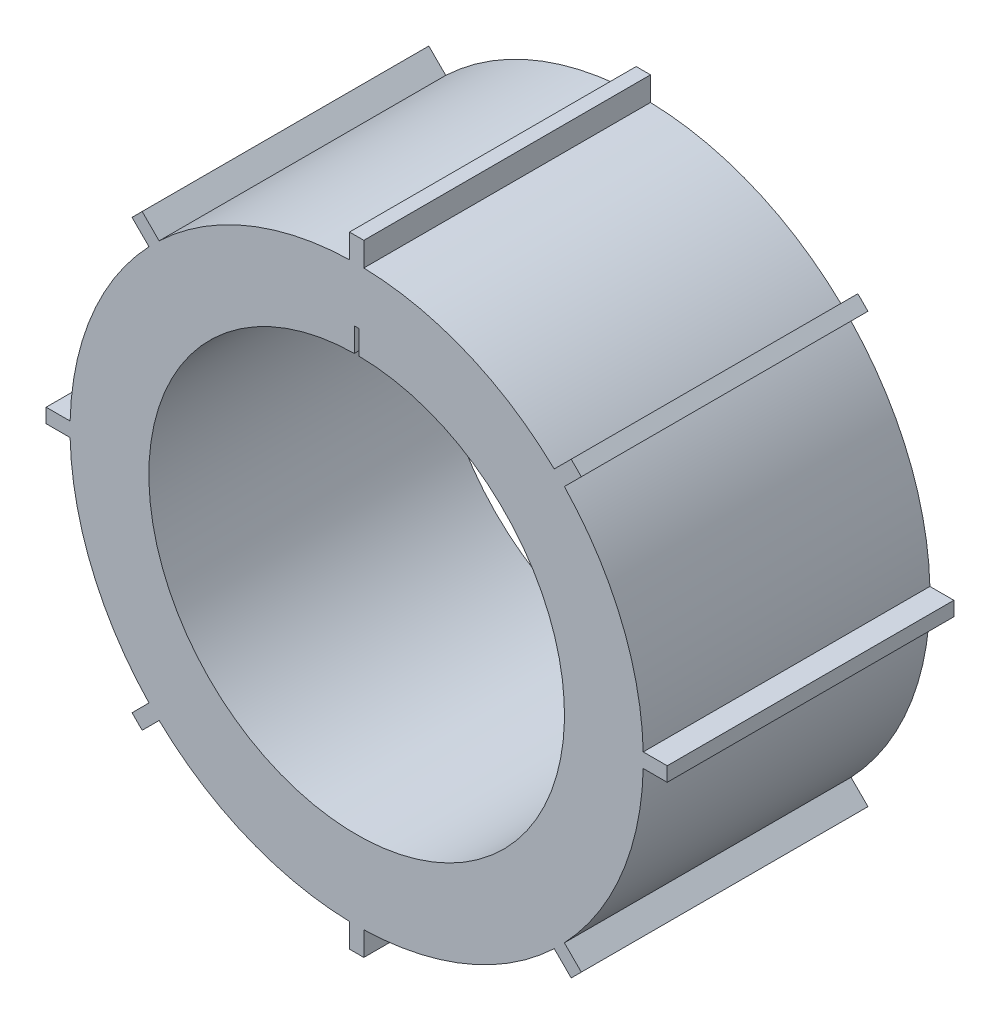
ISO-10303-21;
HEADER;
FILE_DESCRIPTION(('STEP AP214'),'2;1');
FILE_NAME('part.step','',(''),(''),'','','');
FILE_SCHEMA(('AUTOMOTIVE_DESIGN { 1 0 10303 214 1 1 1 1 }'));
ENDSEC;
DATA;
#1=APPLICATION_CONTEXT('core data for automotive mechanical design processes');
#2=APPLICATION_PROTOCOL_DEFINITION('international standard','automotive_design',2000,#1);
#3=PRODUCT_CONTEXT('',#1,'mechanical');
#4=PRODUCT('Part','Part','',(#3));
#5=PRODUCT_RELATED_PRODUCT_CATEGORY('part','',(#4));
#6=PRODUCT_DEFINITION_FORMATION('','',#4);
#7=PRODUCT_DEFINITION_CONTEXT('part definition',#1,'design');
#8=PRODUCT_DEFINITION('design','',#6,#7);
#9=PRODUCT_DEFINITION_SHAPE('','',#8);
#10=(LENGTH_UNIT() NAMED_UNIT(*) SI_UNIT(.MILLI.,.METRE.));
#11=(NAMED_UNIT(*) PLANE_ANGLE_UNIT() SI_UNIT($,.RADIAN.));
#12=(NAMED_UNIT(*) SI_UNIT($,.STERADIAN.) SOLID_ANGLE_UNIT());
#13=UNCERTAINTY_MEASURE_WITH_UNIT(LENGTH_MEASURE(1.E-05),#10,'distance_accuracy_value','');
#14=(GEOMETRIC_REPRESENTATION_CONTEXT(3) GLOBAL_UNCERTAINTY_ASSIGNED_CONTEXT((#13)) GLOBAL_UNIT_ASSIGNED_CONTEXT((#10,
#11,#12)) REPRESENTATION_CONTEXT('',''));
#15=CARTESIAN_POINT('',(0.,0.,0.));
#16=DIRECTION('',(0.,0.,1.));
#17=DIRECTION('',(1.,0.,0.));
#18=AXIS2_PLACEMENT_3D('',#15,#16,#17);
#19=CARTESIAN_POINT('',(0.,0.,60.));
#20=DIRECTION('',(0.,0.,-1.));
#21=DIRECTION('',(-1.,0.,0.));
#22=AXIS2_PLACEMENT_3D('',#19,#20,#21);
#23=CYLINDRICAL_SURFACE('',#22,60.);
#24=CARTESIAN_POINT('',(0.,0.,60.));
#25=DIRECTION('',(0.,0.,1.));
#26=DIRECTION('',(1.,0.,0.));
#27=AXIS2_PLACEMENT_3D('',#24,#25,#26);
#28=CIRCLE('',#27,60.);
#29=CARTESIAN_POINT('',(-43.4738067185754,41.3524863750168,60.));
#30=VERTEX_POINT('',#29);
#31=CARTESIAN_POINT('',(-59.9812470693966,1.50000000000063,60.));
#32=VERTEX_POINT('',#31);
#33=EDGE_CURVE('E44',#30,#32,#28,.T.);
#34=ORIENTED_EDGE('',*,*,#33,.F.);
#35=DIRECTION('',(0.,0.,1.));
#36=VECTOR('',#35,1.);
#37=CARTESIAN_POINT('',(-43.4738067185754,41.3524863750168,0.));
#38=LINE('',#37,#36);
#39=CARTESIAN_POINT('',(-43.4738067185754,41.3524863750168,0.));
#40=VERTEX_POINT('',#39);
#41=EDGE_CURVE('E300',#40,#30,#38,.T.);
#42=ORIENTED_EDGE('',*,*,#41,.F.);
#43=CARTESIAN_POINT('',(0.,0.,0.));
#44=DIRECTION('',(0.,0.,1.));
#45=DIRECTION('',(1.,0.,0.));
#46=AXIS2_PLACEMENT_3D('',#43,#44,#45);
#47=CIRCLE('',#46,60.);
#48=CARTESIAN_POINT('',(-59.9812470693966,1.50000000000063,0.));
#49=VERTEX_POINT('',#48);
#50=EDGE_CURVE('E537',#40,#49,#47,.T.);
#51=ORIENTED_EDGE('',*,*,#50,.T.);
#52=DIRECTION('',(0.,0.,1.));
#53=VECTOR('',#52,1.);
#54=CARTESIAN_POINT('',(-59.9812470693966,1.50000000000063,0.));
#55=LINE('',#54,#53);
#56=EDGE_CURVE('E315',#49,#32,#55,.T.);
#57=ORIENTED_EDGE('',*,*,#56,.T.);
#58=EDGE_LOOP('',(#34,#42,#51,#57));
#59=FACE_BOUND('',#58,.T.);
#60=ADVANCED_FACE('F35',(#59),#23,.T.);
#61=CARTESIAN_POINT('',(-59.9812470693966,-1.49999999999937,60.));
#62=VERTEX_POINT('',#61);
#63=CARTESIAN_POINT('',(-43.4738067185763,-41.3524863750159,60.));
#64=VERTEX_POINT('',#63);
#65=EDGE_CURVE('E870',#62,#64,#28,.T.);
#66=ORIENTED_EDGE('',*,*,#65,.F.);
#67=DIRECTION('',(0.,0.,1.));
#68=VECTOR('',#67,1.);
#69=CARTESIAN_POINT('',(-59.9812470693966,-1.49999999999937,0.));
#70=LINE('',#69,#68);
#71=CARTESIAN_POINT('',(-59.9812470693966,-1.49999999999937,0.));
#72=VERTEX_POINT('',#71);
#73=EDGE_CURVE('E323',#72,#62,#70,.T.);
#74=ORIENTED_EDGE('',*,*,#73,.F.);
#75=CARTESIAN_POINT('',(-43.4738067185763,-41.3524863750159,0.));
#76=VERTEX_POINT('',#75);
#77=EDGE_CURVE('E539',#72,#76,#47,.T.);
#78=ORIENTED_EDGE('',*,*,#77,.T.);
#79=DIRECTION('',(0.,0.,1.));
#80=VECTOR('',#79,1.);
#81=CARTESIAN_POINT('',(-43.4738067185763,-41.3524863750159,0.));
#82=LINE('',#81,#80);
#83=EDGE_CURVE('E342',#76,#64,#82,.T.);
#84=ORIENTED_EDGE('',*,*,#83,.T.);
#85=EDGE_LOOP('',(#66,#74,#78,#84));
#86=FACE_BOUND('',#85,.T.);
#87=ADVANCED_FACE('F593',(#86),#23,.T.);
#88=CARTESIAN_POINT('',(-41.3524863750166,-43.4738067185755,60.));
#89=VERTEX_POINT('',#88);
#90=CARTESIAN_POINT('',(-1.50000000000042,-59.9812470693966,60.));
#91=VERTEX_POINT('',#90);
#92=EDGE_CURVE('E573',#89,#91,#28,.T.);
#93=ORIENTED_EDGE('',*,*,#92,.F.);
#94=DIRECTION('',(0.,0.,1.));
#95=VECTOR('',#94,1.);
#96=CARTESIAN_POINT('',(-41.3524863750166,-43.4738067185755,0.));
#97=LINE('',#96,#95);
#98=CARTESIAN_POINT('',(-41.3524863750166,-43.4738067185755,0.));
#99=VERTEX_POINT('',#98);
#100=EDGE_CURVE('E350',#99,#89,#97,.T.);
#101=ORIENTED_EDGE('',*,*,#100,.F.);
#102=CARTESIAN_POINT('',(-1.50000000000042,-59.9812470693966,0.));
#103=VERTEX_POINT('',#102);
#104=EDGE_CURVE('E541',#99,#103,#47,.T.);
#105=ORIENTED_EDGE('',*,*,#104,.T.);
#106=DIRECTION('',(0.,0.,1.));
#107=VECTOR('',#106,1.);
#108=CARTESIAN_POINT('',(-1.50000000000042,-59.9812470693966,0.));
#109=LINE('',#108,#107);
#110=EDGE_CURVE('E370',#103,#91,#109,.T.);
#111=ORIENTED_EDGE('',*,*,#110,.T.);
#112=EDGE_LOOP('',(#93,#101,#105,#111));
#113=FACE_BOUND('',#112,.T.);
#114=ADVANCED_FACE('F597',(#113),#23,.T.);
#115=CARTESIAN_POINT('',(1.49999999999958,-59.9812470693966,60.));
#116=VERTEX_POINT('',#115);
#117=CARTESIAN_POINT('',(41.352486375016,-43.4738067185761,60.));
#118=VERTEX_POINT('',#117);
#119=EDGE_CURVE('E571',#116,#118,#28,.T.);
#120=ORIENTED_EDGE('',*,*,#119,.F.);
#121=DIRECTION('',(0.,0.,1.));
#122=VECTOR('',#121,1.);
#123=CARTESIAN_POINT('',(1.49999999999958,-59.9812470693966,0.));
#124=LINE('',#123,#122);
#125=CARTESIAN_POINT('',(1.49999999999958,-59.9812470693966,0.));
#126=VERTEX_POINT('',#125);
#127=EDGE_CURVE('E378',#126,#116,#124,.T.);
#128=ORIENTED_EDGE('',*,*,#127,.F.);
#129=CARTESIAN_POINT('',(41.352486375016,-43.4738067185761,0.));
#130=VERTEX_POINT('',#129);
#131=EDGE_CURVE('E545',#126,#130,#47,.T.);
#132=ORIENTED_EDGE('',*,*,#131,.T.);
#133=DIRECTION('',(0.,0.,1.));
#134=VECTOR('',#133,1.);
#135=CARTESIAN_POINT('',(41.352486375016,-43.4738067185761,0.));
#136=LINE('',#135,#134);
#137=EDGE_CURVE('E398',#130,#118,#136,.T.);
#138=ORIENTED_EDGE('',*,*,#137,.T.);
#139=EDGE_LOOP('',(#120,#128,#132,#138));
#140=FACE_BOUND('',#139,.T.);
#141=ADVANCED_FACE('F616',(#140),#23,.T.);
#142=CARTESIAN_POINT('',(43.4738067185757,-41.3524863750165,60.));
#143=VERTEX_POINT('',#142);
#144=CARTESIAN_POINT('',(59.9812470693966,-1.50000000000021,60.));
#145=VERTEX_POINT('',#144);
#146=EDGE_CURVE('E569',#143,#145,#28,.T.);
#147=ORIENTED_EDGE('',*,*,#146,.F.);
#148=DIRECTION('',(0.,0.,1.));
#149=VECTOR('',#148,1.);
#150=CARTESIAN_POINT('',(43.4738067185757,-41.3524863750165,0.));
#151=LINE('',#150,#149);
#152=CARTESIAN_POINT('',(43.4738067185757,-41.3524863750165,0.));
#153=VERTEX_POINT('',#152);
#154=EDGE_CURVE('E406',#153,#143,#151,.T.);
#155=ORIENTED_EDGE('',*,*,#154,.F.);
#156=CARTESIAN_POINT('',(59.9812470693966,-1.50000000000021,0.));
#157=VERTEX_POINT('',#156);
#158=EDGE_CURVE('E536',#153,#157,#47,.T.);
#159=ORIENTED_EDGE('',*,*,#158,.T.);
#160=DIRECTION('',(0.,0.,1.));
#161=VECTOR('',#160,1.);
#162=CARTESIAN_POINT('',(59.9812470693966,-1.50000000000021,0.));
#163=LINE('',#162,#161);
#164=EDGE_CURVE('E426',#157,#145,#163,.T.);
#165=ORIENTED_EDGE('',*,*,#164,.T.);
#166=EDGE_LOOP('',(#147,#155,#159,#165));
#167=FACE_BOUND('',#166,.T.);
#168=ADVANCED_FACE('F555',(#167),#23,.T.);
#169=CARTESIAN_POINT('',(59.9812470693966,1.49999999999979,60.));
#170=VERTEX_POINT('',#169);
#171=CARTESIAN_POINT('',(43.473806718576,41.3524863750162,60.));
#172=VERTEX_POINT('',#171);
#173=EDGE_CURVE('E572',#170,#172,#28,.T.);
#174=ORIENTED_EDGE('',*,*,#173,.F.);
#175=DIRECTION('',(0.,0.,1.));
#176=VECTOR('',#175,1.);
#177=CARTESIAN_POINT('',(59.9812470693966,1.49999999999979,0.));
#178=LINE('',#177,#176);
#179=CARTESIAN_POINT('',(59.9812470693966,1.49999999999979,0.));
#180=VERTEX_POINT('',#179);
#181=EDGE_CURVE('E434',#180,#170,#178,.T.);
#182=ORIENTED_EDGE('',*,*,#181,.F.);
#183=CARTESIAN_POINT('',(43.473806718576,41.3524863750162,0.));
#184=VERTEX_POINT('',#183);
#185=EDGE_CURVE('E532',#180,#184,#47,.T.);
#186=ORIENTED_EDGE('',*,*,#185,.T.);
#187=DIRECTION('',(0.,0.,1.));
#188=VECTOR('',#187,1.);
#189=CARTESIAN_POINT('',(43.473806718576,41.3524863750162,0.));
#190=LINE('',#189,#188);
#191=EDGE_CURVE('E454',#184,#172,#190,.T.);
#192=ORIENTED_EDGE('',*,*,#191,.T.);
#193=EDGE_LOOP('',(#174,#182,#186,#192));
#194=FACE_BOUND('',#193,.T.);
#195=ADVANCED_FACE('F608',(#194),#23,.T.);
#196=CARTESIAN_POINT('',(41.3524863750163,43.4738067185758,60.));
#197=VERTEX_POINT('',#196);
#198=CARTESIAN_POINT('',(1.5,59.9812470693966,60.));
#199=VERTEX_POINT('',#198);
#200=EDGE_CURVE('E46',#197,#199,#28,.T.);
#201=ORIENTED_EDGE('',*,*,#200,.F.);
#202=DIRECTION('',(0.,0.,1.));
#203=VECTOR('',#202,1.);
#204=CARTESIAN_POINT('',(41.3524863750163,43.4738067185758,0.));
#205=LINE('',#204,#203);
#206=CARTESIAN_POINT('',(41.3524863750163,43.4738067185758,0.));
#207=VERTEX_POINT('',#206);
#208=EDGE_CURVE('E462',#207,#197,#205,.T.);
#209=ORIENTED_EDGE('',*,*,#208,.F.);
#210=CARTESIAN_POINT('',(1.5,59.9812470693966,0.));
#211=VERTEX_POINT('',#210);
#212=EDGE_CURVE('E529',#207,#211,#47,.T.);
#213=ORIENTED_EDGE('',*,*,#212,.T.);
#214=DIRECTION('',(0.,0.,1.));
#215=VECTOR('',#214,1.);
#216=CARTESIAN_POINT('',(1.5,59.9812470693966,0.));
#217=LINE('',#216,#215);
#218=EDGE_CURVE('E482',#211,#199,#217,.T.);
#219=ORIENTED_EDGE('',*,*,#218,.T.);
#220=EDGE_LOOP('',(#201,#209,#213,#219));
#221=FACE_BOUND('',#220,.T.);
#222=ADVANCED_FACE('F576',(#221),#23,.T.);
#223=CARTESIAN_POINT('',(0.,0.,60.));
#224=DIRECTION('',(0.,0.,-1.));
#225=DIRECTION('',(-1.,0.,0.));
#226=AXIS2_PLACEMENT_3D('',#223,#224,#225);
#227=CYLINDRICAL_SURFACE('',#226,43.5);
#228=DIRECTION('',(0.,0.,1.));
#229=VECTOR('',#228,1.);
#230=CARTESIAN_POINT('',(0.500000000000019,43.4971263418631,0.));
#231=LINE('',#230,#229);
#232=CARTESIAN_POINT('',(0.500000000000019,43.4971263418631,0.));
#233=VERTEX_POINT('',#232);
#234=CARTESIAN_POINT('',(0.500000000000019,43.4971263418631,60.));
#235=VERTEX_POINT('',#234);
#236=EDGE_CURVE('E520',#233,#235,#231,.T.);
#237=ORIENTED_EDGE('',*,*,#236,.F.);
#238=CARTESIAN_POINT('',(0.,0.,0.));
#239=DIRECTION('',(0.,0.,1.));
#240=DIRECTION('',(1.,0.,0.));
#241=AXIS2_PLACEMENT_3D('',#238,#239,#240);
#242=CIRCLE('',#241,43.5);
#243=CARTESIAN_POINT('',(-0.50000000000001,43.4971263418631,0.));
#244=VERTEX_POINT('',#243);
#245=EDGE_CURVE('E519',#244,#233,#242,.T.);
#246=ORIENTED_EDGE('',*,*,#245,.F.);
#247=DIRECTION('',(0.,0.,1.));
#248=VECTOR('',#247,1.);
#249=CARTESIAN_POINT('',(-0.50000000000001,43.4971263418632,0.));
#250=LINE('',#249,#248);
#251=CARTESIAN_POINT('',(-0.50000000000001,43.4971263418632,60.));
#252=VERTEX_POINT('',#251);
#253=EDGE_CURVE('E522',#244,#252,#250,.T.);
#254=ORIENTED_EDGE('',*,*,#253,.T.);
#255=CARTESIAN_POINT('',(0.,0.,60.));
#256=DIRECTION('',(0.,0.,1.));
#257=DIRECTION('',(1.,0.,0.));
#258=AXIS2_PLACEMENT_3D('',#255,#256,#257);
#259=CIRCLE('',#258,43.5);
#260=EDGE_CURVE('E526',#252,#235,#259,.T.);
#261=ORIENTED_EDGE('',*,*,#260,.T.);
#262=EDGE_LOOP('',(#237,#246,#254,#261));
#263=FACE_BOUND('',#262,.T.);
#264=ADVANCED_FACE('F37',(#263),#227,.F.);
#265=CARTESIAN_POINT('',(-1.5,59.9812470693966,0.));
#266=VERTEX_POINT('',#265);
#267=CARTESIAN_POINT('',(-41.3524863750157,43.4738067185764,0.));
#268=VERTEX_POINT('',#267);
#269=EDGE_CURVE('E39',#266,#268,#47,.T.);
#270=ORIENTED_EDGE('',*,*,#269,.T.);
#271=DIRECTION('',(0.,0.,1.));
#272=VECTOR('',#271,1.);
#273=CARTESIAN_POINT('',(-41.3524863750157,43.4738067185764,0.));
#274=LINE('',#273,#272);
#275=CARTESIAN_POINT('',(-41.3524863750157,43.4738067185764,60.));
#276=VERTEX_POINT('',#275);
#277=EDGE_CURVE('E60',#268,#276,#274,.T.);
#278=ORIENTED_EDGE('',*,*,#277,.T.);
#279=CARTESIAN_POINT('',(-1.5,59.9812470693966,60.));
#280=VERTEX_POINT('',#279);
#281=EDGE_CURVE('E11',#280,#276,#28,.T.);
#282=ORIENTED_EDGE('',*,*,#281,.F.);
#283=DIRECTION('',(0.,0.,1.));
#284=VECTOR('',#283,1.);
#285=CARTESIAN_POINT('',(-1.5,59.9812470693966,0.));
#286=LINE('',#285,#284);
#287=EDGE_CURVE('E490',#266,#280,#286,.T.);
#288=ORIENTED_EDGE('',*,*,#287,.F.);
#289=EDGE_LOOP('',(#270,#278,#282,#288));
#290=FACE_BOUND('',#289,.T.);
#291=ADVANCED_FACE('F588',(#290),#23,.T.);
#292=CARTESIAN_POINT('',(0.,0.,60.));
#293=DIRECTION('',(0.,0.,1.));
#294=DIRECTION('',(1.,0.,0.));
#295=AXIS2_PLACEMENT_3D('',#292,#293,#294);
#296=PLANE('',#295);
#297=DIRECTION('',(0.,1.,0.));
#298=VECTOR('',#297,1.);
#299=CARTESIAN_POINT('',(0.500000000000018,43.4971263418631,60.));
#300=LINE('',#299,#298);
#301=CARTESIAN_POINT('',(0.5,48.5,60.));
#302=VERTEX_POINT('',#301);
#303=EDGE_CURVE('E504',#235,#302,#300,.T.);
#304=ORIENTED_EDGE('',*,*,#303,.F.);
#305=ORIENTED_EDGE('',*,*,#260,.F.);
#306=DIRECTION('',(0.,-1.,0.));
#307=VECTOR('',#306,1.);
#308=CARTESIAN_POINT('',(-0.5,48.5,60.));
#309=LINE('',#308,#307);
#310=CARTESIAN_POINT('',(-0.5,48.5,60.));
#311=VERTEX_POINT('',#310);
#312=EDGE_CURVE('E513',#311,#252,#309,.T.);
#313=ORIENTED_EDGE('',*,*,#312,.F.);
#314=DIRECTION('',(-1.,0.,0.));
#315=VECTOR('',#314,1.);
#316=CARTESIAN_POINT('',(0.5,48.5,60.));
#317=LINE('',#316,#315);
#318=EDGE_CURVE('E493',#302,#311,#317,.T.);
#319=ORIENTED_EDGE('',*,*,#318,.F.);
#320=EDGE_LOOP('',(#304,#305,#313,#319));
#321=FACE_BOUND('',#320,.T.);
#322=ORIENTED_EDGE('',*,*,#281,.T.);
#323=DIRECTION('',(-0.707106781186548,0.707106781186548,0.));
#324=VECTOR('',#323,1.);
#325=CARTESIAN_POINT('',(-41.3524863750157,43.4738067185764,60.));
#326=LINE('',#325,#324);
#327=CARTESIAN_POINT('',(-44.9012806053475,47.0226009489082,60.));
#328=VERTEX_POINT('',#327);
#329=EDGE_CURVE('E297',#276,#328,#326,.T.);
#330=ORIENTED_EDGE('',*,*,#329,.T.);
#331=DIRECTION('',(-0.707106781186548,-0.707106781186548,0.));
#332=VECTOR('',#331,1.);
#333=CARTESIAN_POINT('',(-44.9012806053475,47.0226009489082,60.));
#334=LINE('',#333,#332);
#335=CARTESIAN_POINT('',(-47.0226009489071,44.9012806053485,60.));
#336=VERTEX_POINT('',#335);
#337=EDGE_CURVE('E276',#328,#336,#334,.T.);
#338=ORIENTED_EDGE('',*,*,#337,.T.);
#339=DIRECTION('',(0.707106781186548,-0.707106781186548,0.));
#340=VECTOR('',#339,1.);
#341=CARTESIAN_POINT('',(-43.4738067185754,41.3524863750168,60.));
#342=LINE('',#341,#340);
#343=EDGE_CURVE('E291',#336,#30,#342,.T.);
#344=ORIENTED_EDGE('',*,*,#343,.T.);
#345=ORIENTED_EDGE('',*,*,#33,.T.);
#346=DIRECTION('',(-1.,0.,0.));
#347=VECTOR('',#346,1.);
#348=CARTESIAN_POINT('',(-59.9812470693966,1.50000000000063,60.));
#349=LINE('',#348,#347);
#350=CARTESIAN_POINT('',(-65.0000000000031,1.50000000000073,60.));
#351=VERTEX_POINT('',#350);
#352=EDGE_CURVE('E302',#32,#351,#349,.T.);
#353=ORIENTED_EDGE('',*,*,#352,.T.);
#354=DIRECTION('',(0.,-1.,0.));
#355=VECTOR('',#354,1.);
#356=CARTESIAN_POINT('',(-65.0000000000031,1.50000000000073,60.));
#357=LINE('',#356,#355);
#358=CARTESIAN_POINT('',(-65.0000000000032,-1.49999999999927,60.));
#359=VERTEX_POINT('',#358);
#360=EDGE_CURVE('E318',#351,#359,#357,.T.);
#361=ORIENTED_EDGE('',*,*,#360,.T.);
#362=DIRECTION('',(1.,0.,0.));
#363=VECTOR('',#362,1.);
#364=CARTESIAN_POINT('',(-59.9812470693966,-1.49999999999937,60.));
#365=LINE('',#364,#363);
#366=EDGE_CURVE('E309',#359,#62,#365,.T.);
#367=ORIENTED_EDGE('',*,*,#366,.T.);
#368=ORIENTED_EDGE('',*,*,#65,.T.);
#369=DIRECTION('',(-0.707106781186578,-0.707106781186517,0.));
#370=VECTOR('',#369,1.);
#371=CARTESIAN_POINT('',(-43.4738067185763,-41.3524863750159,60.));
#372=LINE('',#371,#370);
#373=CARTESIAN_POINT('',(-47.0226009489081,-44.9012806053475,60.));
#374=VERTEX_POINT('',#373);
#375=EDGE_CURVE('E326',#64,#374,#372,.T.);
#376=ORIENTED_EDGE('',*,*,#375,.T.);
#377=DIRECTION('',(0.707106781186544,-0.707106781186551,0.));
#378=VECTOR('',#377,1.);
#379=CARTESIAN_POINT('',(-47.0226009489081,-44.9012806053475,60.));
#380=LINE('',#379,#378);
#381=CARTESIAN_POINT('',(-44.9012806053485,-47.0226009489071,60.));
#382=VERTEX_POINT('',#381);
#383=EDGE_CURVE('E345',#374,#382,#380,.T.);
#384=ORIENTED_EDGE('',*,*,#383,.T.);
#385=DIRECTION('',(0.707106781186577,0.707106781186518,0.));
#386=VECTOR('',#385,1.);
#387=CARTESIAN_POINT('',(-41.3524863750166,-43.4738067185755,60.));
#388=LINE('',#387,#386);
#389=EDGE_CURVE('E336',#382,#89,#388,.T.);
#390=ORIENTED_EDGE('',*,*,#389,.T.);
#391=ORIENTED_EDGE('',*,*,#92,.T.);
#392=DIRECTION('',(0.,-1.,0.));
#393=VECTOR('',#392,1.);
#394=CARTESIAN_POINT('',(-1.50000000000042,-59.9812470693966,60.));
#395=LINE('',#394,#393);
#396=CARTESIAN_POINT('',(-1.50000000000073,-65.0000000000031,60.));
#397=VERTEX_POINT('',#396);
#398=EDGE_CURVE('E353',#91,#397,#395,.T.);
#399=ORIENTED_EDGE('',*,*,#398,.T.);
#400=DIRECTION('',(1.,0.,0.));
#401=VECTOR('',#400,1.);
#402=CARTESIAN_POINT('',(-1.50000000000073,-65.0000000000031,60.));
#403=LINE('',#402,#401);
#404=CARTESIAN_POINT('',(1.49999999999926,-65.0000000000032,60.));
#405=VERTEX_POINT('',#404);
#406=EDGE_CURVE('E373',#397,#405,#403,.T.);
#407=ORIENTED_EDGE('',*,*,#406,.T.);
#408=DIRECTION('',(0.,1.,0.));
#409=VECTOR('',#408,1.);
#410=CARTESIAN_POINT('',(1.49999999999958,-59.9812470693966,60.));
#411=LINE('',#410,#409);
#412=EDGE_CURVE('E364',#405,#116,#411,.T.);
#413=ORIENTED_EDGE('',*,*,#412,.T.);
#414=ORIENTED_EDGE('',*,*,#119,.T.);
#415=DIRECTION('',(0.707106781186488,-0.707106781186608,0.));
#416=VECTOR('',#415,1.);
#417=CARTESIAN_POINT('',(41.352486375016,-43.4738067185761,60.));
#418=LINE('',#417,#416);
#419=CARTESIAN_POINT('',(44.9012806053475,-47.0226009489081,60.));
#420=VERTEX_POINT('',#419);
#421=EDGE_CURVE('E381',#118,#420,#418,.T.);
#422=ORIENTED_EDGE('',*,*,#421,.T.);
#423=DIRECTION('',(0.707106781186551,0.707106781186544,0.));
#424=VECTOR('',#423,1.);
#425=CARTESIAN_POINT('',(44.9012806053475,-47.0226009489081,60.));
#426=LINE('',#425,#424);
#427=CARTESIAN_POINT('',(47.0226009489071,-44.9012806053485,60.));
#428=VERTEX_POINT('',#427);
#429=EDGE_CURVE('E401',#420,#428,#426,.T.);
#430=ORIENTED_EDGE('',*,*,#429,.T.);
#431=DIRECTION('',(-0.707106781186488,0.707106781186607,0.));
#432=VECTOR('',#431,1.);
#433=CARTESIAN_POINT('',(43.4738067185757,-41.3524863750165,60.));
#434=LINE('',#433,#432);
#435=EDGE_CURVE('E392',#428,#143,#434,.T.);
#436=ORIENTED_EDGE('',*,*,#435,.T.);
#437=ORIENTED_EDGE('',*,*,#146,.T.);
#438=DIRECTION('',(1.,-1.04904262520716E-13,0.));
#439=VECTOR('',#438,1.);
#440=CARTESIAN_POINT('',(59.9812470693966,-1.50000000000021,60.));
#441=LINE('',#440,#439);
#442=CARTESIAN_POINT('',(65.0000000000031,-1.50000000000074,60.));
#443=VERTEX_POINT('',#442);
#444=EDGE_CURVE('E409',#145,#443,#441,.T.);
#445=ORIENTED_EDGE('',*,*,#444,.T.);
#446=DIRECTION('',(0.,1.,0.));
#447=VECTOR('',#446,1.);
#448=CARTESIAN_POINT('',(65.0000000000031,-1.50000000000074,60.));
#449=LINE('',#448,#447);
#450=CARTESIAN_POINT('',(65.0000000000032,1.49999999999926,60.));
#451=VERTEX_POINT('',#450);
#452=EDGE_CURVE('E429',#443,#451,#449,.T.);
#453=ORIENTED_EDGE('',*,*,#452,.T.);
#454=DIRECTION('',(-1.,1.05854795377164E-13,0.));
#455=VECTOR('',#454,1.);
#456=CARTESIAN_POINT('',(59.9812470693966,1.49999999999979,60.));
#457=LINE('',#456,#455);
#458=EDGE_CURVE('E420',#451,#170,#457,.T.);
#459=ORIENTED_EDGE('',*,*,#458,.T.);
#460=ORIENTED_EDGE('',*,*,#173,.T.);
#461=DIRECTION('',(0.707106781186637,0.707106781186458,0.));
#462=VECTOR('',#461,1.);
#463=CARTESIAN_POINT('',(43.473806718576,41.3524863750162,60.));
#464=LINE('',#463,#462);
#465=CARTESIAN_POINT('',(47.0226009489082,44.9012806053475,60.));
#466=VERTEX_POINT('',#465);
#467=EDGE_CURVE('E437',#172,#466,#464,.T.);
#468=ORIENTED_EDGE('',*,*,#467,.T.);
#469=DIRECTION('',(-0.707106781186544,0.707106781186551,0.));
#470=VECTOR('',#469,1.);
#471=CARTESIAN_POINT('',(47.0226009489082,44.9012806053475,60.));
#472=LINE('',#471,#470);
#473=CARTESIAN_POINT('',(44.9012806053485,47.0226009489071,60.));
#474=VERTEX_POINT('',#473);
#475=EDGE_CURVE('E457',#466,#474,#472,.T.);
#476=ORIENTED_EDGE('',*,*,#475,.T.);
#477=DIRECTION('',(-0.707106781186637,-0.707106781186458,0.));
#478=VECTOR('',#477,1.);
#479=CARTESIAN_POINT('',(41.3524863750163,43.4738067185758,60.));
#480=LINE('',#479,#478);
#481=EDGE_CURVE('E448',#474,#197,#480,.T.);
#482=ORIENTED_EDGE('',*,*,#481,.T.);
#483=ORIENTED_EDGE('',*,*,#200,.T.);
#484=DIRECTION('',(1.474190048273E-13,1.,0.));
#485=VECTOR('',#484,1.);
#486=CARTESIAN_POINT('',(1.5,59.9812470693966,60.));
#487=LINE('',#486,#485);
#488=CARTESIAN_POINT('',(1.50000000000074,65.0000000000031,60.));
#489=VERTEX_POINT('',#488);
#490=EDGE_CURVE('E465',#199,#489,#487,.T.);
#491=ORIENTED_EDGE('',*,*,#490,.T.);
#492=DIRECTION('',(-1.,0.,0.));
#493=VECTOR('',#492,1.);
#494=CARTESIAN_POINT('',(1.50000000000074,65.0000000000031,60.));
#495=LINE('',#494,#493);
#496=CARTESIAN_POINT('',(-1.49999999999926,65.0000000000032,60.));
#497=VERTEX_POINT('',#496);
#498=EDGE_CURVE('E485',#489,#497,#495,.T.);
#499=ORIENTED_EDGE('',*,*,#498,.T.);
#500=DIRECTION('',(-1.48369537683747E-13,-1.,0.));
#501=VECTOR('',#500,1.);
#502=CARTESIAN_POINT('',(-1.5,59.9812470693966,60.));
#503=LINE('',#502,#501);
#504=EDGE_CURVE('E476',#497,#280,#503,.T.);
#505=ORIENTED_EDGE('',*,*,#504,.T.);
#506=EDGE_LOOP('',(#322,#330,#338,#344,#345,#353,#361,#367,#368,#376,#384,#390,#391,#399,#407,
#413,#414,#422,#430,#436,#437,#445,#453,#459,#460,#468,#476,#482,#483,#491,#499,#505));
#507=FACE_BOUND('',#506,.T.);
#508=ADVANCED_FACE('F568',(#321,#507),#296,.T.);
#509=CARTESIAN_POINT('',(0.,0.,0.));
#510=DIRECTION('',(0.,0.,1.));
#511=DIRECTION('',(1.,0.,0.));
#512=AXIS2_PLACEMENT_3D('',#509,#510,#511);
#513=PLANE('',#512);
#514=ORIENTED_EDGE('',*,*,#245,.T.);
#515=DIRECTION('',(0.,1.,0.));
#516=VECTOR('',#515,1.);
#517=CARTESIAN_POINT('',(0.500000000000018,43.4971263418631,0.));
#518=LINE('',#517,#516);
#519=CARTESIAN_POINT('',(0.5,48.5,0.));
#520=VERTEX_POINT('',#519);
#521=EDGE_CURVE('E507',#233,#520,#518,.T.);
#522=ORIENTED_EDGE('',*,*,#521,.T.);
#523=DIRECTION('',(-1.,0.,0.));
#524=VECTOR('',#523,1.);
#525=CARTESIAN_POINT('',(0.5,48.5,0.));
#526=LINE('',#525,#524);
#527=CARTESIAN_POINT('',(-0.5,48.5,0.));
#528=VERTEX_POINT('',#527);
#529=EDGE_CURVE('E500',#520,#528,#526,.T.);
#530=ORIENTED_EDGE('',*,*,#529,.T.);
#531=DIRECTION('',(0.,-1.,0.));
#532=VECTOR('',#531,1.);
#533=CARTESIAN_POINT('',(-0.5,48.5,0.));
#534=LINE('',#533,#532);
#535=EDGE_CURVE('E503',#528,#244,#534,.T.);
#536=ORIENTED_EDGE('',*,*,#535,.T.);
#537=EDGE_LOOP('',(#514,#522,#530,#536));
#538=FACE_BOUND('',#537,.T.);
#539=ORIENTED_EDGE('',*,*,#269,.F.);
#540=DIRECTION('',(-1.48369537683747E-13,-1.,0.));
#541=VECTOR('',#540,1.);
#542=CARTESIAN_POINT('',(-1.5,59.9812470693966,0.));
#543=LINE('',#542,#541);
#544=CARTESIAN_POINT('',(-1.49999999999926,65.0000000000032,0.));
#545=VERTEX_POINT('',#544);
#546=EDGE_CURVE('E479',#545,#266,#543,.T.);
#547=ORIENTED_EDGE('',*,*,#546,.F.);
#548=DIRECTION('',(-1.,0.,0.));
#549=VECTOR('',#548,1.);
#550=CARTESIAN_POINT('',(1.50000000000074,65.0000000000031,0.));
#551=LINE('',#550,#549);
#552=CARTESIAN_POINT('',(1.50000000000074,65.0000000000031,0.));
#553=VERTEX_POINT('',#552);
#554=EDGE_CURVE('E475',#553,#545,#551,.T.);
#555=ORIENTED_EDGE('',*,*,#554,.F.);
#556=DIRECTION('',(1.474190048273E-13,1.,0.));
#557=VECTOR('',#556,1.);
#558=CARTESIAN_POINT('',(1.5,59.9812470693966,0.));
#559=LINE('',#558,#557);
#560=EDGE_CURVE('E472',#211,#553,#559,.T.);
#561=ORIENTED_EDGE('',*,*,#560,.F.);
#562=ORIENTED_EDGE('',*,*,#212,.F.);
#563=DIRECTION('',(-0.707106781186637,-0.707106781186458,0.));
#564=VECTOR('',#563,1.);
#565=CARTESIAN_POINT('',(41.3524863750163,43.4738067185758,0.));
#566=LINE('',#565,#564);
#567=CARTESIAN_POINT('',(44.9012806053485,47.0226009489071,0.));
#568=VERTEX_POINT('',#567);
#569=EDGE_CURVE('E451',#568,#207,#566,.T.);
#570=ORIENTED_EDGE('',*,*,#569,.F.);
#571=DIRECTION('',(-0.707106781186544,0.707106781186551,0.));
#572=VECTOR('',#571,1.);
#573=CARTESIAN_POINT('',(47.0226009489082,44.9012806053475,0.));
#574=LINE('',#573,#572);
#575=CARTESIAN_POINT('',(47.0226009489082,44.9012806053475,0.));
#576=VERTEX_POINT('',#575);
#577=EDGE_CURVE('E447',#576,#568,#574,.T.);
#578=ORIENTED_EDGE('',*,*,#577,.F.);
#579=DIRECTION('',(0.707106781186637,0.707106781186458,0.));
#580=VECTOR('',#579,1.);
#581=CARTESIAN_POINT('',(43.473806718576,41.3524863750162,0.));
#582=LINE('',#581,#580);
#583=EDGE_CURVE('E444',#184,#576,#582,.T.);
#584=ORIENTED_EDGE('',*,*,#583,.F.);
#585=ORIENTED_EDGE('',*,*,#185,.F.);
#586=DIRECTION('',(-1.,1.05854795377164E-13,0.));
#587=VECTOR('',#586,1.);
#588=CARTESIAN_POINT('',(59.9812470693966,1.49999999999979,0.));
#589=LINE('',#588,#587);
#590=CARTESIAN_POINT('',(65.0000000000032,1.49999999999926,0.));
#591=VERTEX_POINT('',#590);
#592=EDGE_CURVE('E423',#591,#180,#589,.T.);
#593=ORIENTED_EDGE('',*,*,#592,.F.);
#594=DIRECTION('',(0.,1.,0.));
#595=VECTOR('',#594,1.);
#596=CARTESIAN_POINT('',(65.0000000000031,-1.50000000000074,0.));
#597=LINE('',#596,#595);
#598=CARTESIAN_POINT('',(65.0000000000031,-1.50000000000074,0.));
#599=VERTEX_POINT('',#598);
#600=EDGE_CURVE('E419',#599,#591,#597,.T.);
#601=ORIENTED_EDGE('',*,*,#600,.F.);
#602=DIRECTION('',(1.,-1.04904262520716E-13,0.));
#603=VECTOR('',#602,1.);
#604=CARTESIAN_POINT('',(59.9812470693966,-1.50000000000021,0.));
#605=LINE('',#604,#603);
#606=EDGE_CURVE('E416',#157,#599,#605,.T.);
#607=ORIENTED_EDGE('',*,*,#606,.F.);
#608=ORIENTED_EDGE('',*,*,#158,.F.);
#609=DIRECTION('',(-0.707106781186488,0.707106781186607,0.));
#610=VECTOR('',#609,1.);
#611=CARTESIAN_POINT('',(43.4738067185757,-41.3524863750165,0.));
#612=LINE('',#611,#610);
#613=CARTESIAN_POINT('',(47.0226009489071,-44.9012806053485,0.));
#614=VERTEX_POINT('',#613);
#615=EDGE_CURVE('E395',#614,#153,#612,.T.);
#616=ORIENTED_EDGE('',*,*,#615,.F.);
#617=DIRECTION('',(0.707106781186551,0.707106781186544,0.));
#618=VECTOR('',#617,1.);
#619=CARTESIAN_POINT('',(44.9012806053475,-47.0226009489081,0.));
#620=LINE('',#619,#618);
#621=CARTESIAN_POINT('',(44.9012806053475,-47.0226009489081,0.));
#622=VERTEX_POINT('',#621);
#623=EDGE_CURVE('E391',#622,#614,#620,.T.);
#624=ORIENTED_EDGE('',*,*,#623,.F.);
#625=DIRECTION('',(0.707106781186488,-0.707106781186608,0.));
#626=VECTOR('',#625,1.);
#627=CARTESIAN_POINT('',(41.352486375016,-43.4738067185761,0.));
#628=LINE('',#627,#626);
#629=EDGE_CURVE('E388',#130,#622,#628,.T.);
#630=ORIENTED_EDGE('',*,*,#629,.F.);
#631=ORIENTED_EDGE('',*,*,#131,.F.);
#632=DIRECTION('',(0.,1.,0.));
#633=VECTOR('',#632,1.);
#634=CARTESIAN_POINT('',(1.49999999999958,-59.9812470693966,0.));
#635=LINE('',#634,#633);
#636=CARTESIAN_POINT('',(1.49999999999926,-65.0000000000032,0.));
#637=VERTEX_POINT('',#636);
#638=EDGE_CURVE('E367',#637,#126,#635,.T.);
#639=ORIENTED_EDGE('',*,*,#638,.F.);
#640=DIRECTION('',(1.,0.,0.));
#641=VECTOR('',#640,1.);
#642=CARTESIAN_POINT('',(-1.50000000000073,-65.0000000000031,0.));
#643=LINE('',#642,#641);
#644=CARTESIAN_POINT('',(-1.50000000000073,-65.0000000000031,0.));
#645=VERTEX_POINT('',#644);
#646=EDGE_CURVE('E363',#645,#637,#643,.T.);
#647=ORIENTED_EDGE('',*,*,#646,.F.);
#648=DIRECTION('',(0.,-1.,0.));
#649=VECTOR('',#648,1.);
#650=CARTESIAN_POINT('',(-1.50000000000042,-59.9812470693966,0.));
#651=LINE('',#650,#649);
#652=EDGE_CURVE('E360',#103,#645,#651,.T.);
#653=ORIENTED_EDGE('',*,*,#652,.F.);
#654=ORIENTED_EDGE('',*,*,#104,.F.);
#655=DIRECTION('',(0.707106781186577,0.707106781186518,0.));
#656=VECTOR('',#655,1.);
#657=CARTESIAN_POINT('',(-41.3524863750166,-43.4738067185755,0.));
#658=LINE('',#657,#656);
#659=CARTESIAN_POINT('',(-44.9012806053485,-47.0226009489071,0.));
#660=VERTEX_POINT('',#659);
#661=EDGE_CURVE('E339',#660,#99,#658,.T.);
#662=ORIENTED_EDGE('',*,*,#661,.F.);
#663=DIRECTION('',(0.707106781186544,-0.707106781186551,0.));
#664=VECTOR('',#663,1.);
#665=CARTESIAN_POINT('',(-47.0226009489081,-44.9012806053475,0.));
#666=LINE('',#665,#664);
#667=CARTESIAN_POINT('',(-47.0226009489081,-44.9012806053475,0.));
#668=VERTEX_POINT('',#667);
#669=EDGE_CURVE('E335',#668,#660,#666,.T.);
#670=ORIENTED_EDGE('',*,*,#669,.F.);
#671=DIRECTION('',(-0.707106781186578,-0.707106781186517,0.));
#672=VECTOR('',#671,1.);
#673=CARTESIAN_POINT('',(-43.4738067185763,-41.3524863750159,0.));
#674=LINE('',#673,#672);
#675=EDGE_CURVE('E332',#76,#668,#674,.T.);
#676=ORIENTED_EDGE('',*,*,#675,.F.);
#677=ORIENTED_EDGE('',*,*,#77,.F.);
#678=DIRECTION('',(1.,0.,0.));
#679=VECTOR('',#678,1.);
#680=CARTESIAN_POINT('',(-59.9812470693966,-1.49999999999937,0.));
#681=LINE('',#680,#679);
#682=CARTESIAN_POINT('',(-65.0000000000032,-1.49999999999927,0.));
#683=VERTEX_POINT('',#682);
#684=EDGE_CURVE('E312',#683,#72,#681,.T.);
#685=ORIENTED_EDGE('',*,*,#684,.F.);
#686=DIRECTION('',(0.,-1.,0.));
#687=VECTOR('',#686,1.);
#688=CARTESIAN_POINT('',(-65.0000000000031,1.50000000000073,0.));
#689=LINE('',#688,#687);
#690=CARTESIAN_POINT('',(-65.0000000000031,1.50000000000073,0.));
#691=VERTEX_POINT('',#690);
#692=EDGE_CURVE('E308',#691,#683,#689,.T.);
#693=ORIENTED_EDGE('',*,*,#692,.F.);
#694=DIRECTION('',(-1.,0.,0.));
#695=VECTOR('',#694,1.);
#696=CARTESIAN_POINT('',(-59.9812470693966,1.50000000000063,0.));
#697=LINE('',#696,#695);
#698=EDGE_CURVE('E305',#49,#691,#697,.T.);
#699=ORIENTED_EDGE('',*,*,#698,.F.);
#700=ORIENTED_EDGE('',*,*,#50,.F.);
#701=DIRECTION('',(0.707106781186548,-0.707106781186548,0.));
#702=VECTOR('',#701,1.);
#703=CARTESIAN_POINT('',(-43.4738067185754,41.3524863750168,0.));
#704=LINE('',#703,#702);
#705=CARTESIAN_POINT('',(-47.0226009489071,44.9012806053485,0.));
#706=VERTEX_POINT('',#705);
#707=EDGE_CURVE('E288',#706,#40,#704,.T.);
#708=ORIENTED_EDGE('',*,*,#707,.F.);
#709=DIRECTION('',(-0.707106781186548,-0.707106781186548,0.));
#710=VECTOR('',#709,1.);
#711=CARTESIAN_POINT('',(-44.9012806053475,47.0226009489082,0.));
#712=LINE('',#711,#710);
#713=CARTESIAN_POINT('',(-44.9012806053475,47.0226009489082,0.));
#714=VERTEX_POINT('',#713);
#715=EDGE_CURVE('E273',#714,#706,#712,.T.);
#716=ORIENTED_EDGE('',*,*,#715,.F.);
#717=DIRECTION('',(-0.707106781186548,0.707106781186548,0.));
#718=VECTOR('',#717,1.);
#719=CARTESIAN_POINT('',(-41.3524863750157,43.4738067185764,0.));
#720=LINE('',#719,#718);
#721=EDGE_CURVE('E286',#268,#714,#720,.T.);
#722=ORIENTED_EDGE('',*,*,#721,.F.);
#723=EDGE_LOOP('',(#539,#547,#555,#561,#562,#570,#578,#584,#585,#593,#601,#607,#608,#616,#624,
#630,#631,#639,#647,#653,#654,#662,#670,#676,#677,#685,#693,#699,#700,#708,#716,#722));
#724=FACE_BOUND('',#723,.T.);
#725=ADVANCED_FACE('F285',(#538,#724),#513,.F.);
#726=CARTESIAN_POINT('',(0.5,48.5,0.));
#727=DIRECTION('',(0.,1.,0.));
#728=DIRECTION('',(0.,0.,1.));
#729=AXIS2_PLACEMENT_3D('',#726,#727,#728);
#730=PLANE('',#729);
#731=ORIENTED_EDGE('',*,*,#318,.T.);
#732=DIRECTION('',(0.,0.,1.));
#733=VECTOR('',#732,1.);
#734=CARTESIAN_POINT('',(-0.5,48.5,0.));
#735=LINE('',#734,#733);
#736=EDGE_CURVE('E510',#528,#311,#735,.T.);
#737=ORIENTED_EDGE('',*,*,#736,.F.);
#738=ORIENTED_EDGE('',*,*,#529,.F.);
#739=DIRECTION('',(0.,0.,1.));
#740=VECTOR('',#739,1.);
#741=CARTESIAN_POINT('',(0.5,48.5,0.));
#742=LINE('',#741,#740);
#743=EDGE_CURVE('E517',#520,#302,#742,.T.);
#744=ORIENTED_EDGE('',*,*,#743,.T.);
#745=EDGE_LOOP('',(#731,#737,#738,#744));
#746=FACE_BOUND('',#745,.T.);
#747=ADVANCED_FACE('F657',(#746),#730,.F.);
#748=CARTESIAN_POINT('',(0.500000000000018,43.4971263418631,0.));
#749=DIRECTION('',(1.,0.,0.));
#750=DIRECTION('',(0.,1.,0.));
#751=AXIS2_PLACEMENT_3D('',#748,#749,#750);
#752=PLANE('',#751);
#753=ORIENTED_EDGE('',*,*,#303,.T.);
#754=ORIENTED_EDGE('',*,*,#743,.F.);
#755=ORIENTED_EDGE('',*,*,#521,.F.);
#756=ORIENTED_EDGE('',*,*,#236,.T.);
#757=EDGE_LOOP('',(#753,#754,#755,#756));
#758=FACE_BOUND('',#757,.T.);
#759=ADVANCED_FACE('F654',(#758),#752,.F.);
#760=CARTESIAN_POINT('',(-0.5,48.5,0.));
#761=DIRECTION('',(-1.,0.,0.));
#762=DIRECTION('',(0.,-1.,0.));
#763=AXIS2_PLACEMENT_3D('',#760,#761,#762);
#764=PLANE('',#763);
#765=ORIENTED_EDGE('',*,*,#312,.T.);
#766=ORIENTED_EDGE('',*,*,#253,.F.);
#767=ORIENTED_EDGE('',*,*,#535,.F.);
#768=ORIENTED_EDGE('',*,*,#736,.T.);
#769=EDGE_LOOP('',(#765,#766,#767,#768));
#770=FACE_BOUND('',#769,.T.);
#771=ADVANCED_FACE('F649',(#770),#764,.F.);
#772=CARTESIAN_POINT('',(-1.5,59.9812470693966,0.));
#773=DIRECTION('',(-1.,1.48369537683747E-13,0.));
#774=DIRECTION('',(-1.48369537683747E-13,-1.,0.));
#775=AXIS2_PLACEMENT_3D('',#772,#773,#774);
#776=PLANE('',#775);
#777=ORIENTED_EDGE('',*,*,#504,.F.);
#778=DIRECTION('',(0.,0.,1.));
#779=VECTOR('',#778,1.);
#780=CARTESIAN_POINT('',(-1.49999999999926,65.0000000000032,0.));
#781=LINE('',#780,#779);
#782=EDGE_CURVE('E494',#545,#497,#781,.T.);
#783=ORIENTED_EDGE('',*,*,#782,.F.);
#784=ORIENTED_EDGE('',*,*,#546,.T.);
#785=ORIENTED_EDGE('',*,*,#287,.T.);
#786=EDGE_LOOP('',(#777,#783,#784,#785));
#787=FACE_BOUND('',#786,.T.);
#788=ADVANCED_FACE('F586',(#787),#776,.T.);
#789=CARTESIAN_POINT('',(1.50000000000074,65.0000000000031,0.));
#790=DIRECTION('',(0.,1.,0.));
#791=DIRECTION('',(-1.,0.,0.));
#792=AXIS2_PLACEMENT_3D('',#789,#790,#791);
#793=PLANE('',#792);
#794=ORIENTED_EDGE('',*,*,#498,.F.);
#795=DIRECTION('',(0.,0.,1.));
#796=VECTOR('',#795,1.);
#797=CARTESIAN_POINT('',(1.50000000000074,65.0000000000031,0.));
#798=LINE('',#797,#796);
#799=EDGE_CURVE('E496',#553,#489,#798,.T.);
#800=ORIENTED_EDGE('',*,*,#799,.F.);
#801=ORIENTED_EDGE('',*,*,#554,.T.);
#802=ORIENTED_EDGE('',*,*,#782,.T.);
#803=EDGE_LOOP('',(#794,#800,#801,#802));
#804=FACE_BOUND('',#803,.T.);
#805=ADVANCED_FACE('F583',(#804),#793,.T.);
#806=CARTESIAN_POINT('',(1.5,59.9812470693966,0.));
#807=DIRECTION('',(1.,-1.474190048273E-13,0.));
#808=DIRECTION('',(1.474190048273E-13,1.,0.));
#809=AXIS2_PLACEMENT_3D('',#806,#807,#808);
#810=PLANE('',#809);
#811=ORIENTED_EDGE('',*,*,#490,.F.);
#812=ORIENTED_EDGE('',*,*,#218,.F.);
#813=ORIENTED_EDGE('',*,*,#560,.T.);
#814=ORIENTED_EDGE('',*,*,#799,.T.);
#815=EDGE_LOOP('',(#811,#812,#813,#814));
#816=FACE_BOUND('',#815,.T.);
#817=ADVANCED_FACE('F579',(#816),#810,.T.);
#818=CARTESIAN_POINT('',(41.3524863750163,43.4738067185758,0.));
#819=DIRECTION('',(-0.707106781186458,0.707106781186637,0.));
#820=DIRECTION('',(-0.707106781186637,-0.707106781186458,0.));
#821=AXIS2_PLACEMENT_3D('',#818,#819,#820);
#822=PLANE('',#821);
#823=ORIENTED_EDGE('',*,*,#481,.F.);
#824=DIRECTION('',(0.,0.,1.));
#825=VECTOR('',#824,1.);
#826=CARTESIAN_POINT('',(44.9012806053485,47.0226009489071,0.));
#827=LINE('',#826,#825);
#828=EDGE_CURVE('E466',#568,#474,#827,.T.);
#829=ORIENTED_EDGE('',*,*,#828,.F.);
#830=ORIENTED_EDGE('',*,*,#569,.T.);
#831=ORIENTED_EDGE('',*,*,#208,.T.);
#832=EDGE_LOOP('',(#823,#829,#830,#831));
#833=FACE_BOUND('',#832,.T.);
#834=ADVANCED_FACE('F640',(#833),#822,.T.);
#835=CARTESIAN_POINT('',(47.0226009489082,44.9012806053475,0.));
#836=DIRECTION('',(0.707106781186551,0.707106781186544,0.));
#837=DIRECTION('',(-0.707106781186544,0.707106781186551,0.));
#838=AXIS2_PLACEMENT_3D('',#835,#836,#837);
#839=PLANE('',#838);
#840=ORIENTED_EDGE('',*,*,#475,.F.);
#841=DIRECTION('',(0.,0.,1.));
#842=VECTOR('',#841,1.);
#843=CARTESIAN_POINT('',(47.0226009489082,44.9012806053475,0.));
#844=LINE('',#843,#842);
#845=EDGE_CURVE('E468',#576,#466,#844,.T.);
#846=ORIENTED_EDGE('',*,*,#845,.F.);
#847=ORIENTED_EDGE('',*,*,#577,.T.);
#848=ORIENTED_EDGE('',*,*,#828,.T.);
#849=EDGE_LOOP('',(#840,#846,#847,#848));
#850=FACE_BOUND('',#849,.T.);
#851=ADVANCED_FACE('F630',(#850),#839,.T.);
#852=CARTESIAN_POINT('',(43.473806718576,41.3524863750162,0.));
#853=DIRECTION('',(0.707106781186458,-0.707106781186637,0.));
#854=DIRECTION('',(0.707106781186637,0.707106781186458,0.));
#855=AXIS2_PLACEMENT_3D('',#852,#853,#854);
#856=PLANE('',#855);
#857=ORIENTED_EDGE('',*,*,#467,.F.);
#858=ORIENTED_EDGE('',*,*,#191,.F.);
#859=ORIENTED_EDGE('',*,*,#583,.T.);
#860=ORIENTED_EDGE('',*,*,#845,.T.);
#861=EDGE_LOOP('',(#857,#858,#859,#860));
#862=FACE_BOUND('',#861,.T.);
#863=ADVANCED_FACE('F623',(#862),#856,.T.);
#864=CARTESIAN_POINT('',(59.9812470693966,1.49999999999979,0.));
#865=DIRECTION('',(1.05854795377164E-13,1.,0.));
#866=DIRECTION('',(-1.,1.05854795377164E-13,0.));
#867=AXIS2_PLACEMENT_3D('',#864,#865,#866);
#868=PLANE('',#867);
#869=ORIENTED_EDGE('',*,*,#458,.F.);
#870=DIRECTION('',(0.,0.,1.));
#871=VECTOR('',#870,1.);
#872=CARTESIAN_POINT('',(65.0000000000032,1.49999999999926,0.));
#873=LINE('',#872,#871);
#874=EDGE_CURVE('E438',#591,#451,#873,.T.);
#875=ORIENTED_EDGE('',*,*,#874,.F.);
#876=ORIENTED_EDGE('',*,*,#592,.T.);
#877=ORIENTED_EDGE('',*,*,#181,.T.);
#878=EDGE_LOOP('',(#869,#875,#876,#877));
#879=FACE_BOUND('',#878,.T.);
#880=ADVANCED_FACE('F621',(#879),#868,.T.);
#881=CARTESIAN_POINT('',(65.0000000000031,-1.50000000000074,0.));
#882=DIRECTION('',(1.,0.,0.));
#883=DIRECTION('',(0.,1.,0.));
#884=AXIS2_PLACEMENT_3D('',#881,#882,#883);
#885=PLANE('',#884);
#886=ORIENTED_EDGE('',*,*,#452,.F.);
#887=DIRECTION('',(0.,0.,1.));
#888=VECTOR('',#887,1.);
#889=CARTESIAN_POINT('',(65.0000000000031,-1.50000000000074,0.));
#890=LINE('',#889,#888);
#891=EDGE_CURVE('E440',#599,#443,#890,.T.);
#892=ORIENTED_EDGE('',*,*,#891,.F.);
#893=ORIENTED_EDGE('',*,*,#600,.T.);
#894=ORIENTED_EDGE('',*,*,#874,.T.);
#895=EDGE_LOOP('',(#886,#892,#893,#894));
#896=FACE_BOUND('',#895,.T.);
#897=ADVANCED_FACE('F565',(#896),#885,.T.);
#898=CARTESIAN_POINT('',(59.9812470693966,-1.50000000000021,0.));
#899=DIRECTION('',(-1.04904262520716E-13,-1.,0.));
#900=DIRECTION('',(1.,-1.04904262520716E-13,0.));
#901=AXIS2_PLACEMENT_3D('',#898,#899,#900);
#902=PLANE('',#901);
#903=ORIENTED_EDGE('',*,*,#444,.F.);
#904=ORIENTED_EDGE('',*,*,#164,.F.);
#905=ORIENTED_EDGE('',*,*,#606,.T.);
#906=ORIENTED_EDGE('',*,*,#891,.T.);
#907=EDGE_LOOP('',(#903,#904,#905,#906));
#908=FACE_BOUND('',#907,.T.);
#909=ADVANCED_FACE('F560',(#908),#902,.T.);
#910=CARTESIAN_POINT('',(43.4738067185757,-41.3524863750165,0.));
#911=DIRECTION('',(0.707106781186607,0.707106781186488,0.));
#912=DIRECTION('',(-0.707106781186488,0.707106781186607,0.));
#913=AXIS2_PLACEMENT_3D('',#910,#911,#912);
#914=PLANE('',#913);
#915=ORIENTED_EDGE('',*,*,#435,.F.);
#916=DIRECTION('',(0.,0.,1.));
#917=VECTOR('',#916,1.);
#918=CARTESIAN_POINT('',(47.0226009489071,-44.9012806053485,0.));
#919=LINE('',#918,#917);
#920=EDGE_CURVE('E410',#614,#428,#919,.T.);
#921=ORIENTED_EDGE('',*,*,#920,.F.);
#922=ORIENTED_EDGE('',*,*,#615,.T.);
#923=ORIENTED_EDGE('',*,*,#154,.T.);
#924=EDGE_LOOP('',(#915,#921,#922,#923));
#925=FACE_BOUND('',#924,.T.);
#926=ADVANCED_FACE('F639',(#925),#914,.T.);
#927=CARTESIAN_POINT('',(44.9012806053475,-47.0226009489081,0.));
#928=DIRECTION('',(0.707106781186544,-0.707106781186551,0.));
#929=DIRECTION('',(0.707106781186551,0.707106781186544,0.));
#930=AXIS2_PLACEMENT_3D('',#927,#928,#929);
#931=PLANE('',#930);
#932=ORIENTED_EDGE('',*,*,#429,.F.);
#933=DIRECTION('',(0.,0.,1.));
#934=VECTOR('',#933,1.);
#935=CARTESIAN_POINT('',(44.9012806053475,-47.0226009489081,0.));
#936=LINE('',#935,#934);
#937=EDGE_CURVE('E412',#622,#420,#936,.T.);
#938=ORIENTED_EDGE('',*,*,#937,.F.);
#939=ORIENTED_EDGE('',*,*,#623,.T.);
#940=ORIENTED_EDGE('',*,*,#920,.T.);
#941=EDGE_LOOP('',(#932,#938,#939,#940));
#942=FACE_BOUND('',#941,.T.);
#943=ADVANCED_FACE('F731',(#942),#931,.T.);
#944=CARTESIAN_POINT('',(41.352486375016,-43.4738067185761,0.));
#945=DIRECTION('',(-0.707106781186608,-0.707106781186487,0.));
#946=DIRECTION('',(0.707106781186487,-0.707106781186608,0.));
#947=AXIS2_PLACEMENT_3D('',#944,#945,#946);
#948=PLANE('',#947);
#949=ORIENTED_EDGE('',*,*,#421,.F.);
#950=ORIENTED_EDGE('',*,*,#137,.F.);
#951=ORIENTED_EDGE('',*,*,#629,.T.);
#952=ORIENTED_EDGE('',*,*,#937,.T.);
#953=EDGE_LOOP('',(#949,#950,#951,#952));
#954=FACE_BOUND('',#953,.T.);
#955=ADVANCED_FACE('F634',(#954),#948,.T.);
#956=CARTESIAN_POINT('',(1.49999999999958,-59.9812470693966,0.));
#957=DIRECTION('',(1.,0.,0.));
#958=DIRECTION('',(0.,1.,0.));
#959=AXIS2_PLACEMENT_3D('',#956,#957,#958);
#960=PLANE('',#959);
#961=ORIENTED_EDGE('',*,*,#412,.F.);
#962=DIRECTION('',(0.,0.,1.));
#963=VECTOR('',#962,1.);
#964=CARTESIAN_POINT('',(1.49999999999926,-65.0000000000032,0.));
#965=LINE('',#964,#963);
#966=EDGE_CURVE('E382',#637,#405,#965,.T.);
#967=ORIENTED_EDGE('',*,*,#966,.F.);
#968=ORIENTED_EDGE('',*,*,#638,.T.);
#969=ORIENTED_EDGE('',*,*,#127,.T.);
#970=EDGE_LOOP('',(#961,#967,#968,#969));
#971=FACE_BOUND('',#970,.T.);
#972=ADVANCED_FACE('F749',(#971),#960,.T.);
#973=CARTESIAN_POINT('',(-1.50000000000073,-65.0000000000031,0.));
#974=DIRECTION('',(0.,-1.,0.));
#975=DIRECTION('',(1.,0.,0.));
#976=AXIS2_PLACEMENT_3D('',#973,#974,#975);
#977=PLANE('',#976);
#978=ORIENTED_EDGE('',*,*,#406,.F.);
#979=DIRECTION('',(0.,0.,1.));
#980=VECTOR('',#979,1.);
#981=CARTESIAN_POINT('',(-1.50000000000073,-65.0000000000031,0.));
#982=LINE('',#981,#980);
#983=EDGE_CURVE('E384',#645,#397,#982,.T.);
#984=ORIENTED_EDGE('',*,*,#983,.F.);
#985=ORIENTED_EDGE('',*,*,#646,.T.);
#986=ORIENTED_EDGE('',*,*,#966,.T.);
#987=EDGE_LOOP('',(#978,#984,#985,#986));
#988=FACE_BOUND('',#987,.T.);
#989=ADVANCED_FACE('F758',(#988),#977,.T.);
#990=CARTESIAN_POINT('',(-1.50000000000042,-59.9812470693966,0.));
#991=DIRECTION('',(-1.,0.,0.));
#992=DIRECTION('',(0.,-1.,0.));
#993=AXIS2_PLACEMENT_3D('',#990,#991,#992);
#994=PLANE('',#993);
#995=ORIENTED_EDGE('',*,*,#398,.F.);
#996=ORIENTED_EDGE('',*,*,#110,.F.);
#997=ORIENTED_EDGE('',*,*,#652,.T.);
#998=ORIENTED_EDGE('',*,*,#983,.T.);
#999=EDGE_LOOP('',(#995,#996,#997,#998));
#1000=FACE_BOUND('',#999,.T.);
#1001=ADVANCED_FACE('F768',(#1000),#994,.T.);
#1002=CARTESIAN_POINT('',(-41.3524863750166,-43.4738067185755,0.));
#1003=DIRECTION('',(0.707106781186518,-0.707106781186577,0.));
#1004=DIRECTION('',(0.707106781186577,0.707106781186518,0.));
#1005=AXIS2_PLACEMENT_3D('',#1002,#1003,#1004);
#1006=PLANE('',#1005);
#1007=ORIENTED_EDGE('',*,*,#389,.F.);
#1008=DIRECTION('',(0.,0.,1.));
#1009=VECTOR('',#1008,1.);
#1010=CARTESIAN_POINT('',(-44.9012806053485,-47.0226009489071,0.));
#1011=LINE('',#1010,#1009);
#1012=EDGE_CURVE('E354',#660,#382,#1011,.T.);
#1013=ORIENTED_EDGE('',*,*,#1012,.F.);
#1014=ORIENTED_EDGE('',*,*,#661,.T.);
#1015=ORIENTED_EDGE('',*,*,#100,.T.);
#1016=EDGE_LOOP('',(#1007,#1013,#1014,#1015));
#1017=FACE_BOUND('',#1016,.T.);
#1018=ADVANCED_FACE('F778',(#1017),#1006,.T.);
#1019=CARTESIAN_POINT('',(-47.0226009489081,-44.9012806053475,0.));
#1020=DIRECTION('',(-0.707106781186551,-0.707106781186544,0.));
#1021=DIRECTION('',(0.707106781186544,-0.707106781186551,0.));
#1022=AXIS2_PLACEMENT_3D('',#1019,#1020,#1021);
#1023=PLANE('',#1022);
#1024=ORIENTED_EDGE('',*,*,#383,.F.);
#1025=DIRECTION('',(0.,0.,1.));
#1026=VECTOR('',#1025,1.);
#1027=CARTESIAN_POINT('',(-47.0226009489081,-44.9012806053475,0.));
#1028=LINE('',#1027,#1026);
#1029=EDGE_CURVE('E356',#668,#374,#1028,.T.);
#1030=ORIENTED_EDGE('',*,*,#1029,.F.);
#1031=ORIENTED_EDGE('',*,*,#669,.T.);
#1032=ORIENTED_EDGE('',*,*,#1012,.T.);
#1033=EDGE_LOOP('',(#1024,#1030,#1031,#1032));
#1034=FACE_BOUND('',#1033,.T.);
#1035=ADVANCED_FACE('F788',(#1034),#1023,.T.);
#1036=CARTESIAN_POINT('',(-43.4738067185763,-41.3524863750159,0.));
#1037=DIRECTION('',(-0.707106781186517,0.707106781186578,0.));
#1038=DIRECTION('',(-0.707106781186578,-0.707106781186517,0.));
#1039=AXIS2_PLACEMENT_3D('',#1036,#1037,#1038);
#1040=PLANE('',#1039);
#1041=ORIENTED_EDGE('',*,*,#375,.F.);
#1042=ORIENTED_EDGE('',*,*,#83,.F.);
#1043=ORIENTED_EDGE('',*,*,#675,.T.);
#1044=ORIENTED_EDGE('',*,*,#1029,.T.);
#1045=EDGE_LOOP('',(#1041,#1042,#1043,#1044));
#1046=FACE_BOUND('',#1045,.T.);
#1047=ADVANCED_FACE('F798',(#1046),#1040,.T.);
#1048=CARTESIAN_POINT('',(-59.9812470693966,-1.49999999999937,0.));
#1049=DIRECTION('',(0.,-1.,0.));
#1050=DIRECTION('',(1.,0.,0.));
#1051=AXIS2_PLACEMENT_3D('',#1048,#1049,#1050);
#1052=PLANE('',#1051);
#1053=ORIENTED_EDGE('',*,*,#366,.F.);
#1054=DIRECTION('',(0.,0.,1.));
#1055=VECTOR('',#1054,1.);
#1056=CARTESIAN_POINT('',(-65.0000000000032,-1.49999999999927,0.));
#1057=LINE('',#1056,#1055);
#1058=EDGE_CURVE('E327',#683,#359,#1057,.T.);
#1059=ORIENTED_EDGE('',*,*,#1058,.F.);
#1060=ORIENTED_EDGE('',*,*,#684,.T.);
#1061=ORIENTED_EDGE('',*,*,#73,.T.);
#1062=EDGE_LOOP('',(#1053,#1059,#1060,#1061));
#1063=FACE_BOUND('',#1062,.T.);
#1064=ADVANCED_FACE('F808',(#1063),#1052,.T.);
#1065=CARTESIAN_POINT('',(-65.0000000000031,1.50000000000073,0.));
#1066=DIRECTION('',(-1.,0.,0.));
#1067=DIRECTION('',(0.,-1.,0.));
#1068=AXIS2_PLACEMENT_3D('',#1065,#1066,#1067);
#1069=PLANE('',#1068);
#1070=ORIENTED_EDGE('',*,*,#360,.F.);
#1071=DIRECTION('',(0.,0.,1.));
#1072=VECTOR('',#1071,1.);
#1073=CARTESIAN_POINT('',(-65.0000000000031,1.50000000000073,0.));
#1074=LINE('',#1073,#1072);
#1075=EDGE_CURVE('E329',#691,#351,#1074,.T.);
#1076=ORIENTED_EDGE('',*,*,#1075,.F.);
#1077=ORIENTED_EDGE('',*,*,#692,.T.);
#1078=ORIENTED_EDGE('',*,*,#1058,.T.);
#1079=EDGE_LOOP('',(#1070,#1076,#1077,#1078));
#1080=FACE_BOUND('',#1079,.T.);
#1081=ADVANCED_FACE('F818',(#1080),#1069,.T.);
#1082=CARTESIAN_POINT('',(-59.9812470693966,1.50000000000063,0.));
#1083=DIRECTION('',(0.,1.,0.));
#1084=DIRECTION('',(-1.,0.,0.));
#1085=AXIS2_PLACEMENT_3D('',#1082,#1083,#1084);
#1086=PLANE('',#1085);
#1087=ORIENTED_EDGE('',*,*,#352,.F.);
#1088=ORIENTED_EDGE('',*,*,#56,.F.);
#1089=ORIENTED_EDGE('',*,*,#698,.T.);
#1090=ORIENTED_EDGE('',*,*,#1075,.T.);
#1091=EDGE_LOOP('',(#1087,#1088,#1089,#1090));
#1092=FACE_BOUND('',#1091,.T.);
#1093=ADVANCED_FACE('F828',(#1092),#1086,.T.);
#1094=CARTESIAN_POINT('',(-43.4738067185754,41.3524863750168,0.));
#1095=DIRECTION('',(-0.707106781186547,-0.707106781186547,0.));
#1096=DIRECTION('',(0.707106781186548,-0.707106781186548,0.));
#1097=AXIS2_PLACEMENT_3D('',#1094,#1095,#1096);
#1098=PLANE('',#1097);
#1099=ORIENTED_EDGE('',*,*,#343,.F.);
#1100=DIRECTION('',(0.,0.,1.));
#1101=VECTOR('',#1100,1.);
#1102=CARTESIAN_POINT('',(-47.0226009489071,44.9012806053485,0.));
#1103=LINE('',#1102,#1101);
#1104=EDGE_CURVE('E281',#706,#336,#1103,.T.);
#1105=ORIENTED_EDGE('',*,*,#1104,.F.);
#1106=ORIENTED_EDGE('',*,*,#707,.T.);
#1107=ORIENTED_EDGE('',*,*,#41,.T.);
#1108=EDGE_LOOP('',(#1099,#1105,#1106,#1107));
#1109=FACE_BOUND('',#1108,.T.);
#1110=ADVANCED_FACE('F591',(#1109),#1098,.T.);
#1111=CARTESIAN_POINT('',(-44.9012806053475,47.0226009489082,0.));
#1112=DIRECTION('',(-0.707106781186547,0.707106781186547,0.));
#1113=DIRECTION('',(-0.707106781186548,-0.707106781186548,0.));
#1114=AXIS2_PLACEMENT_3D('',#1111,#1112,#1113);
#1115=PLANE('',#1114);
#1116=ORIENTED_EDGE('',*,*,#337,.F.);
#1117=DIRECTION('',(0.,0.,1.));
#1118=VECTOR('',#1117,1.);
#1119=CARTESIAN_POINT('',(-44.9012806053475,47.0226009489082,0.));
#1120=LINE('',#1119,#1118);
#1121=EDGE_CURVE('E270',#714,#328,#1120,.T.);
#1122=ORIENTED_EDGE('',*,*,#1121,.F.);
#1123=ORIENTED_EDGE('',*,*,#715,.T.);
#1124=ORIENTED_EDGE('',*,*,#1104,.T.);
#1125=EDGE_LOOP('',(#1116,#1122,#1123,#1124));
#1126=FACE_BOUND('',#1125,.T.);
#1127=ADVANCED_FACE('F272',(#1126),#1115,.T.);
#1128=CARTESIAN_POINT('',(-41.3524863750157,43.4738067185764,0.));
#1129=DIRECTION('',(0.707106781186547,0.707106781186547,0.));
#1130=DIRECTION('',(-0.707106781186548,0.707106781186548,0.));
#1131=AXIS2_PLACEMENT_3D('',#1128,#1129,#1130);
#1132=PLANE('',#1131);
#1133=ORIENTED_EDGE('',*,*,#329,.F.);
#1134=ORIENTED_EDGE('',*,*,#277,.F.);
#1135=ORIENTED_EDGE('',*,*,#721,.T.);
#1136=ORIENTED_EDGE('',*,*,#1121,.T.);
#1137=EDGE_LOOP('',(#1133,#1134,#1135,#1136));
#1138=FACE_BOUND('',#1137,.T.);
#1139=ADVANCED_FACE('F290',(#1138),#1132,.T.);
#1140=CLOSED_SHELL('',(#60,#87,#114,#141,#168,#195,#222,#264,#291,#508,#725,#747,#759,#771,#788,
#805,#817,#834,#851,#863,#880,#897,#909,#926,#943,#955,#972,#989,#1001,#1018,#1035,#1047,#1064,
#1081,#1093,#1110,#1127,#1139));
#1141=MANIFOLD_SOLID_BREP('B2',#1140);
#1142=ADVANCED_BREP_SHAPE_REPRESENTATION('',(#18,#1141),#14);
#1143=SHAPE_DEFINITION_REPRESENTATION(#9,#1142);
ENDSEC;
END-ISO-10303-21;
